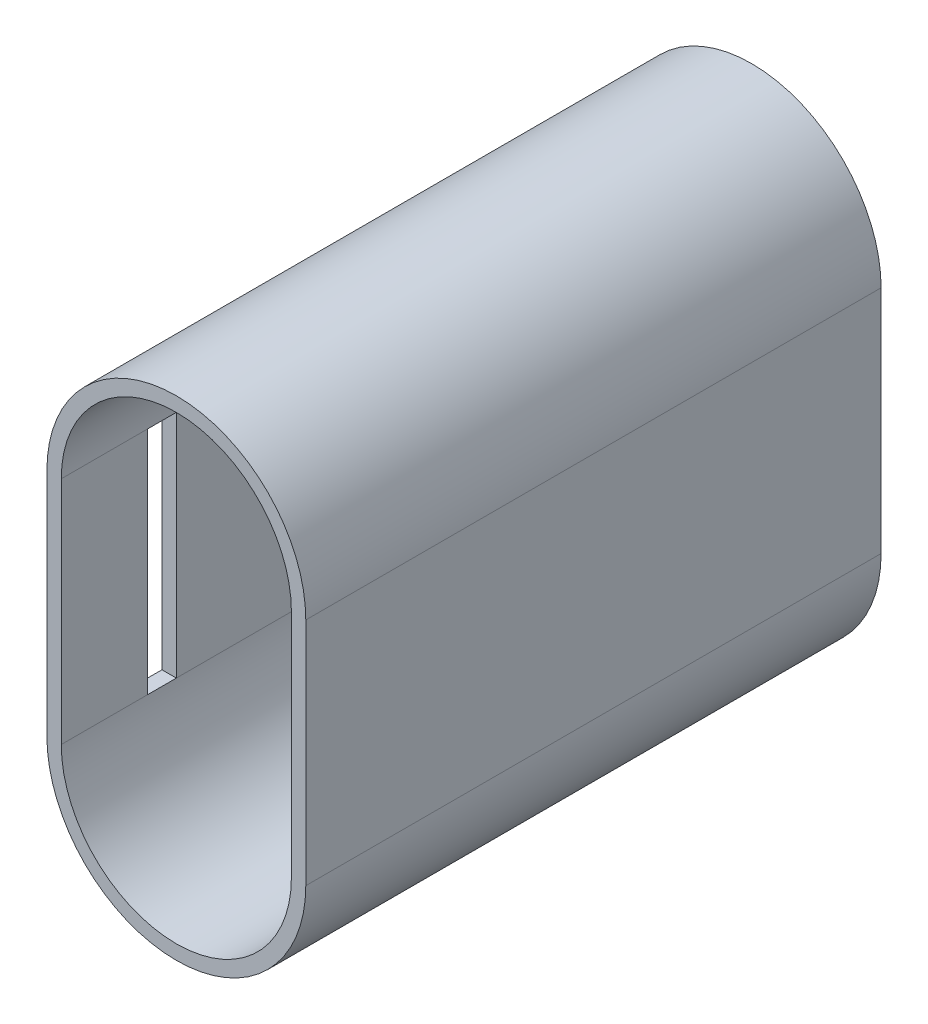
ISO-10303-21;
HEADER;
FILE_DESCRIPTION(('STEP AP214'),'2;1');
FILE_NAME('part.step','',(''),(''),'','','');
FILE_SCHEMA(('AUTOMOTIVE_DESIGN { 1 0 10303 214 1 1 1 1 }'));
ENDSEC;
DATA;
#1=APPLICATION_CONTEXT('core data for automotive mechanical design processes');
#2=APPLICATION_PROTOCOL_DEFINITION('international standard','automotive_design',2000,#1);
#3=PRODUCT_CONTEXT('',#1,'mechanical');
#4=PRODUCT('Part','Part','',(#3));
#5=PRODUCT_RELATED_PRODUCT_CATEGORY('part','',(#4));
#6=PRODUCT_DEFINITION_FORMATION('','',#4);
#7=PRODUCT_DEFINITION_CONTEXT('part definition',#1,'design');
#8=PRODUCT_DEFINITION('design','',#6,#7);
#9=PRODUCT_DEFINITION_SHAPE('','',#8);
#10=(LENGTH_UNIT() NAMED_UNIT(*) SI_UNIT(.MILLI.,.METRE.));
#11=(NAMED_UNIT(*) PLANE_ANGLE_UNIT() SI_UNIT($,.RADIAN.));
#12=(NAMED_UNIT(*) SI_UNIT($,.STERADIAN.) SOLID_ANGLE_UNIT());
#13=UNCERTAINTY_MEASURE_WITH_UNIT(LENGTH_MEASURE(1.E-05),#10,'distance_accuracy_value','');
#14=(GEOMETRIC_REPRESENTATION_CONTEXT(3) GLOBAL_UNCERTAINTY_ASSIGNED_CONTEXT((#13)) GLOBAL_UNIT_ASSIGNED_CONTEXT((#10,
#11,#12)) REPRESENTATION_CONTEXT('',''));
#15=CARTESIAN_POINT('',(0.,0.,0.));
#16=DIRECTION('',(0.,0.,1.));
#17=DIRECTION('',(1.,0.,0.));
#18=AXIS2_PLACEMENT_3D('',#15,#16,#17);
#19=CARTESIAN_POINT('',(-45.,-40.,200.));
#20=DIRECTION('',(1.,0.,0.));
#21=DIRECTION('',(0.,1.,0.));
#22=AXIS2_PLACEMENT_3D('',#19,#20,#21);
#23=PLANE('',#22);
#24=DIRECTION('',(0.,-1.,0.));
#25=VECTOR('',#24,1.);
#26=CARTESIAN_POINT('',(-45.,0.,170.));
#27=LINE('',#26,#25);
#28=CARTESIAN_POINT('',(-45.,40.,170.));
#29=VERTEX_POINT('',#28);
#30=CARTESIAN_POINT('',(-45.,-40.,170.));
#31=VERTEX_POINT('',#30);
#32=EDGE_CURVE('E56',#29,#31,#27,.T.);
#33=ORIENTED_EDGE('',*,*,#32,.T.);
#34=DIRECTION('',(0.,0.,-1.));
#35=VECTOR('',#34,1.);
#36=CARTESIAN_POINT('',(-45.,-40.,200.));
#37=LINE('',#36,#35);
#38=CARTESIAN_POINT('',(-45.,-40.,200.));
#39=VERTEX_POINT('',#38);
#40=EDGE_CURVE('E178',#39,#31,#37,.T.);
#41=ORIENTED_EDGE('',*,*,#40,.F.);
#42=DIRECTION('',(0.,-1.,0.));
#43=VECTOR('',#42,1.);
#44=CARTESIAN_POINT('',(-45.,-40.,200.));
#45=LINE('',#44,#43);
#46=CARTESIAN_POINT('',(-45.,40.,200.));
#47=VERTEX_POINT('',#46);
#48=EDGE_CURVE('E195',#47,#39,#45,.T.);
#49=ORIENTED_EDGE('',*,*,#48,.F.);
#50=DIRECTION('',(0.,0.,-1.));
#51=VECTOR('',#50,1.);
#52=CARTESIAN_POINT('',(-45.,40.,200.));
#53=LINE('',#52,#51);
#54=EDGE_CURVE('E181',#47,#29,#53,.T.);
#55=ORIENTED_EDGE('',*,*,#54,.T.);
#56=EDGE_LOOP('',(#33,#41,#49,#55));
#57=FACE_BOUND('',#56,.T.);
#58=ADVANCED_FACE('F41',(#57),#23,.F.);
#59=CARTESIAN_POINT('',(-40.,-40.,200.));
#60=DIRECTION('',(1.,0.,0.));
#61=DIRECTION('',(0.,1.,0.));
#62=AXIS2_PLACEMENT_3D('',#59,#60,#61);
#63=PLANE('',#62);
#64=DIRECTION('',(0.,0.,-1.));
#65=VECTOR('',#64,1.);
#66=CARTESIAN_POINT('',(-40.,-40.,200.));
#67=LINE('',#66,#65);
#68=CARTESIAN_POINT('',(-40.,-40.,200.));
#69=VERTEX_POINT('',#68);
#70=CARTESIAN_POINT('',(-40.,-40.,170.));
#71=VERTEX_POINT('',#70);
#72=EDGE_CURVE('E228',#69,#71,#67,.T.);
#73=ORIENTED_EDGE('',*,*,#72,.T.);
#74=DIRECTION('',(0.,-1.,0.));
#75=VECTOR('',#74,1.);
#76=CARTESIAN_POINT('',(-40.,0.,170.));
#77=LINE('',#76,#75);
#78=CARTESIAN_POINT('',(-40.,40.,170.));
#79=VERTEX_POINT('',#78);
#80=EDGE_CURVE('E157',#79,#71,#77,.T.);
#81=ORIENTED_EDGE('',*,*,#80,.F.);
#82=DIRECTION('',(0.,0.,-1.));
#83=VECTOR('',#82,1.);
#84=CARTESIAN_POINT('',(-40.,40.,200.));
#85=LINE('',#84,#83);
#86=CARTESIAN_POINT('',(-40.,40.,200.));
#87=VERTEX_POINT('',#86);
#88=EDGE_CURVE('E223',#87,#79,#85,.T.);
#89=ORIENTED_EDGE('',*,*,#88,.F.);
#90=DIRECTION('',(0.,-1.,0.));
#91=VECTOR('',#90,1.);
#92=CARTESIAN_POINT('',(-40.,-40.,200.));
#93=LINE('',#92,#91);
#94=EDGE_CURVE('E247',#87,#69,#93,.T.);
#95=ORIENTED_EDGE('',*,*,#94,.T.);
#96=EDGE_LOOP('',(#73,#81,#89,#95));
#97=FACE_BOUND('',#96,.T.);
#98=ADVANCED_FACE('F359',(#97),#63,.T.);
#99=CARTESIAN_POINT('',(-45.,-40.,160.));
#100=VERTEX_POINT('',#99);
#101=CARTESIAN_POINT('',(-45.,-40.,43.));
#102=VERTEX_POINT('',#101);
#103=EDGE_CURVE('E189',#100,#102,#37,.T.);
#104=ORIENTED_EDGE('',*,*,#103,.F.);
#105=DIRECTION('',(0.,-1.,0.));
#106=VECTOR('',#105,1.);
#107=CARTESIAN_POINT('',(-45.,0.,160.));
#108=LINE('',#107,#106);
#109=CARTESIAN_POINT('',(-45.,40.,160.));
#110=VERTEX_POINT('',#109);
#111=EDGE_CURVE('E172',#110,#100,#108,.T.);
#112=ORIENTED_EDGE('',*,*,#111,.F.);
#113=CARTESIAN_POINT('',(-45.,40.,43.));
#114=VERTEX_POINT('',#113);
#115=EDGE_CURVE('E192',#110,#114,#53,.T.);
#116=ORIENTED_EDGE('',*,*,#115,.T.);
#117=DIRECTION('',(0.,1.,0.));
#118=VECTOR('',#117,1.);
#119=CARTESIAN_POINT('',(-45.,-40.,43.));
#120=LINE('',#119,#118);
#121=EDGE_CURVE('E259',#102,#114,#120,.T.);
#122=ORIENTED_EDGE('',*,*,#121,.F.);
#123=EDGE_LOOP('',(#104,#112,#116,#122));
#124=FACE_BOUND('',#123,.T.);
#125=ADVANCED_FACE('F307',(#124),#23,.F.);
#126=DIRECTION('',(0.,-1.,0.));
#127=VECTOR('',#126,1.);
#128=CARTESIAN_POINT('',(-40.,0.,160.));
#129=LINE('',#128,#127);
#130=CARTESIAN_POINT('',(-40.,40.,160.));
#131=VERTEX_POINT('',#130);
#132=CARTESIAN_POINT('',(-40.,-40.,160.));
#133=VERTEX_POINT('',#132);
#134=EDGE_CURVE('E290',#131,#133,#129,.T.);
#135=ORIENTED_EDGE('',*,*,#134,.T.);
#136=CARTESIAN_POINT('',(-40.,-40.,43.));
#137=VERTEX_POINT('',#136);
#138=EDGE_CURVE('E231',#133,#137,#67,.T.);
#139=ORIENTED_EDGE('',*,*,#138,.T.);
#140=DIRECTION('',(0.,-1.,0.));
#141=VECTOR('',#140,1.);
#142=CARTESIAN_POINT('',(-40.,0.,43.));
#143=LINE('',#142,#141);
#144=CARTESIAN_POINT('',(-40.,40.,43.));
#145=VERTEX_POINT('',#144);
#146=EDGE_CURVE('E182',#145,#137,#143,.T.);
#147=ORIENTED_EDGE('',*,*,#146,.F.);
#148=EDGE_CURVE('E226',#131,#145,#85,.T.);
#149=ORIENTED_EDGE('',*,*,#148,.F.);
#150=EDGE_LOOP('',(#135,#139,#147,#149));
#151=FACE_BOUND('',#150,.T.);
#152=ADVANCED_FACE('F319',(#151),#63,.T.);
#153=CARTESIAN_POINT('',(0.,-40.,200.));
#154=DIRECTION('',(0.,0.,1.));
#155=DIRECTION('',(1.,0.,0.));
#156=AXIS2_PLACEMENT_3D('',#153,#154,#155);
#157=PLANE('',#156);
#158=CARTESIAN_POINT('',(0.,-40.,200.));
#159=DIRECTION('',(0.,0.,1.));
#160=DIRECTION('',(1.,0.,0.));
#161=AXIS2_PLACEMENT_3D('',#158,#159,#160);
#162=CIRCLE('',#161,45.);
#163=CARTESIAN_POINT('',(45.,-40.,200.));
#164=VERTEX_POINT('',#163);
#165=EDGE_CURVE('E187',#39,#164,#162,.T.);
#166=ORIENTED_EDGE('',*,*,#165,.T.);
#167=DIRECTION('',(0.,1.,0.));
#168=VECTOR('',#167,1.);
#169=CARTESIAN_POINT('',(45.,-40.,200.));
#170=LINE('',#169,#168);
#171=CARTESIAN_POINT('',(45.,40.,200.));
#172=VERTEX_POINT('',#171);
#173=EDGE_CURVE('E202',#164,#172,#170,.T.);
#174=ORIENTED_EDGE('',*,*,#173,.T.);
#175=CARTESIAN_POINT('',(0.,40.,200.));
#176=DIRECTION('',(0.,0.,1.));
#177=DIRECTION('',(1.,0.,0.));
#178=AXIS2_PLACEMENT_3D('',#175,#176,#177);
#179=CIRCLE('',#178,45.);
#180=EDGE_CURVE('E199',#172,#47,#179,.T.);
#181=ORIENTED_EDGE('',*,*,#180,.T.);
#182=ORIENTED_EDGE('',*,*,#48,.T.);
#183=EDGE_LOOP('',(#166,#174,#181,#182));
#184=FACE_BOUND('',#183,.T.);
#185=DIRECTION('',(0.,1.,0.));
#186=VECTOR('',#185,1.);
#187=CARTESIAN_POINT('',(40.,-40.,200.));
#188=LINE('',#187,#186);
#189=CARTESIAN_POINT('',(40.,-40.,200.));
#190=VERTEX_POINT('',#189);
#191=CARTESIAN_POINT('',(40.,40.,200.));
#192=VERTEX_POINT('',#191);
#193=EDGE_CURVE('E252',#190,#192,#188,.T.);
#194=ORIENTED_EDGE('',*,*,#193,.F.);
#195=CARTESIAN_POINT('',(0.,-40.,200.));
#196=DIRECTION('',(0.,0.,1.));
#197=DIRECTION('',(1.,0.,0.));
#198=AXIS2_PLACEMENT_3D('',#195,#196,#197);
#199=CIRCLE('',#198,40.);
#200=EDGE_CURVE('E236',#69,#190,#199,.T.);
#201=ORIENTED_EDGE('',*,*,#200,.F.);
#202=ORIENTED_EDGE('',*,*,#94,.F.);
#203=CARTESIAN_POINT('',(0.,40.,200.));
#204=DIRECTION('',(0.,0.,1.));
#205=DIRECTION('',(1.,0.,0.));
#206=AXIS2_PLACEMENT_3D('',#203,#204,#205);
#207=CIRCLE('',#206,40.);
#208=EDGE_CURVE('E249',#192,#87,#207,.T.);
#209=ORIENTED_EDGE('',*,*,#208,.F.);
#210=EDGE_LOOP('',(#194,#201,#202,#209));
#211=FACE_BOUND('',#210,.T.);
#212=ADVANCED_FACE('F354',(#184,#211),#157,.T.);
#213=CARTESIAN_POINT('',(0.,-40.,0.));
#214=DIRECTION('',(0.,0.,1.));
#215=DIRECTION('',(1.,0.,0.));
#216=AXIS2_PLACEMENT_3D('',#213,#214,#215);
#217=PLANE('',#216);
#218=CARTESIAN_POINT('',(0.,-40.,0.));
#219=DIRECTION('',(0.,0.,1.));
#220=DIRECTION('',(1.,0.,0.));
#221=AXIS2_PLACEMENT_3D('',#218,#219,#220);
#222=CIRCLE('',#221,45.);
#223=CARTESIAN_POINT('',(-45.,-40.,0.));
#224=VERTEX_POINT('',#223);
#225=CARTESIAN_POINT('',(45.,-40.,0.));
#226=VERTEX_POINT('',#225);
#227=EDGE_CURVE('E206',#224,#226,#222,.T.);
#228=ORIENTED_EDGE('',*,*,#227,.F.);
#229=DIRECTION('',(0.,-1.,0.));
#230=VECTOR('',#229,1.);
#231=CARTESIAN_POINT('',(-45.,-40.,0.));
#232=LINE('',#231,#230);
#233=CARTESIAN_POINT('',(-45.,40.,0.));
#234=VERTEX_POINT('',#233);
#235=EDGE_CURVE('E213',#234,#224,#232,.T.);
#236=ORIENTED_EDGE('',*,*,#235,.F.);
#237=CARTESIAN_POINT('',(0.,40.,0.));
#238=DIRECTION('',(0.,0.,1.));
#239=DIRECTION('',(1.,0.,0.));
#240=AXIS2_PLACEMENT_3D('',#237,#238,#239);
#241=CIRCLE('',#240,45.);
#242=CARTESIAN_POINT('',(45.,40.,0.));
#243=VERTEX_POINT('',#242);
#244=EDGE_CURVE('E211',#243,#234,#241,.T.);
#245=ORIENTED_EDGE('',*,*,#244,.F.);
#246=DIRECTION('',(0.,1.,0.));
#247=VECTOR('',#246,1.);
#248=CARTESIAN_POINT('',(45.,-40.,0.));
#249=LINE('',#248,#247);
#250=EDGE_CURVE('E208',#226,#243,#249,.T.);
#251=ORIENTED_EDGE('',*,*,#250,.F.);
#252=EDGE_LOOP('',(#228,#236,#245,#251));
#253=FACE_BOUND('',#252,.T.);
#254=CARTESIAN_POINT('',(0.,-40.,0.));
#255=DIRECTION('',(0.,0.,1.));
#256=DIRECTION('',(1.,0.,0.));
#257=AXIS2_PLACEMENT_3D('',#254,#255,#256);
#258=CIRCLE('',#257,40.);
#259=CARTESIAN_POINT('',(-40.,-40.,0.));
#260=VERTEX_POINT('',#259);
#261=CARTESIAN_POINT('',(40.,-40.,0.));
#262=VERTEX_POINT('',#261);
#263=EDGE_CURVE('E243',#260,#262,#258,.T.);
#264=ORIENTED_EDGE('',*,*,#263,.T.);
#265=DIRECTION('',(0.,1.,0.));
#266=VECTOR('',#265,1.);
#267=CARTESIAN_POINT('',(40.,-40.,0.));
#268=LINE('',#267,#266);
#269=CARTESIAN_POINT('',(40.,40.,0.));
#270=VERTEX_POINT('',#269);
#271=EDGE_CURVE('E240',#262,#270,#268,.T.);
#272=ORIENTED_EDGE('',*,*,#271,.T.);
#273=CARTESIAN_POINT('',(0.,40.,0.));
#274=DIRECTION('',(0.,0.,1.));
#275=DIRECTION('',(1.,0.,0.));
#276=AXIS2_PLACEMENT_3D('',#273,#274,#275);
#277=CIRCLE('',#276,40.);
#278=CARTESIAN_POINT('',(-40.,40.,0.));
#279=VERTEX_POINT('',#278);
#280=EDGE_CURVE('E237',#270,#279,#277,.T.);
#281=ORIENTED_EDGE('',*,*,#280,.T.);
#282=DIRECTION('',(0.,-1.,0.));
#283=VECTOR('',#282,1.);
#284=CARTESIAN_POINT('',(-40.,-40.,0.));
#285=LINE('',#284,#283);
#286=EDGE_CURVE('E233',#279,#260,#285,.T.);
#287=ORIENTED_EDGE('',*,*,#286,.T.);
#288=EDGE_LOOP('',(#264,#272,#281,#287));
#289=FACE_BOUND('',#288,.T.);
#290=ADVANCED_FACE('F332',(#253,#289),#217,.F.);
#291=CARTESIAN_POINT('',(0.,-40.,200.));
#292=DIRECTION('',(0.,0.,-1.));
#293=DIRECTION('',(-1.,0.,0.));
#294=AXIS2_PLACEMENT_3D('',#291,#292,#293);
#295=CYLINDRICAL_SURFACE('',#294,45.);
#296=ORIENTED_EDGE('',*,*,#227,.T.);
#297=DIRECTION('',(0.,0.,-1.));
#298=VECTOR('',#297,1.);
#299=CARTESIAN_POINT('',(45.,-40.,200.));
#300=LINE('',#299,#298);
#301=EDGE_CURVE('E11',#164,#226,#300,.T.);
#302=ORIENTED_EDGE('',*,*,#301,.F.);
#303=ORIENTED_EDGE('',*,*,#165,.F.);
#304=ORIENTED_EDGE('',*,*,#40,.T.);
#305=DIRECTION('',(0.,0.,1.));
#306=VECTOR('',#305,1.);
#307=CARTESIAN_POINT('',(-45.,-40.,0.));
#308=LINE('',#307,#306);
#309=EDGE_CURVE('E164',#100,#31,#308,.T.);
#310=ORIENTED_EDGE('',*,*,#309,.F.);
#311=ORIENTED_EDGE('',*,*,#103,.T.);
#312=DIRECTION('',(0.,0.,-1.));
#313=VECTOR('',#312,1.);
#314=CARTESIAN_POINT('',(-45.,-40.,200.));
#315=LINE('',#314,#313);
#316=CARTESIAN_POINT('',(-45.,-40.,30.));
#317=VERTEX_POINT('',#316);
#318=EDGE_CURVE('E257',#102,#317,#315,.T.);
#319=ORIENTED_EDGE('',*,*,#318,.T.);
#320=EDGE_CURVE('E191',#317,#224,#37,.T.);
#321=ORIENTED_EDGE('',*,*,#320,.T.);
#322=EDGE_LOOP('',(#296,#302,#303,#304,#310,#311,#319,#321));
#323=FACE_BOUND('',#322,.T.);
#324=ADVANCED_FACE('F43',(#323),#295,.T.);
#325=CARTESIAN_POINT('',(45.,-40.,200.));
#326=DIRECTION('',(-1.,0.,0.));
#327=DIRECTION('',(0.,-1.,0.));
#328=AXIS2_PLACEMENT_3D('',#325,#326,#327);
#329=PLANE('',#328);
#330=ORIENTED_EDGE('',*,*,#250,.T.);
#331=DIRECTION('',(0.,0.,-1.));
#332=VECTOR('',#331,1.);
#333=CARTESIAN_POINT('',(45.,40.,200.));
#334=LINE('',#333,#332);
#335=EDGE_CURVE('E49',#172,#243,#334,.T.);
#336=ORIENTED_EDGE('',*,*,#335,.F.);
#337=ORIENTED_EDGE('',*,*,#173,.F.);
#338=ORIENTED_EDGE('',*,*,#301,.T.);
#339=EDGE_LOOP('',(#330,#336,#337,#338));
#340=FACE_BOUND('',#339,.T.);
#341=ADVANCED_FACE('F353',(#340),#329,.F.);
#342=CARTESIAN_POINT('',(0.,40.,200.));
#343=DIRECTION('',(0.,0.,-1.));
#344=DIRECTION('',(-1.,0.,0.));
#345=AXIS2_PLACEMENT_3D('',#342,#343,#344);
#346=CYLINDRICAL_SURFACE('',#345,45.);
#347=ORIENTED_EDGE('',*,*,#244,.T.);
#348=CARTESIAN_POINT('',(-45.,40.,30.));
#349=VERTEX_POINT('',#348);
#350=EDGE_CURVE('E188',#349,#234,#53,.T.);
#351=ORIENTED_EDGE('',*,*,#350,.F.);
#352=DIRECTION('',(0.,0.,1.));
#353=VECTOR('',#352,1.);
#354=CARTESIAN_POINT('',(-45.,40.,200.));
#355=LINE('',#354,#353);
#356=EDGE_CURVE('E262',#349,#114,#355,.T.);
#357=ORIENTED_EDGE('',*,*,#356,.T.);
#358=ORIENTED_EDGE('',*,*,#115,.F.);
#359=DIRECTION('',(0.,0.,-1.));
#360=VECTOR('',#359,1.);
#361=CARTESIAN_POINT('',(-45.,40.,0.));
#362=LINE('',#361,#360);
#363=EDGE_CURVE('E296',#29,#110,#362,.T.);
#364=ORIENTED_EDGE('',*,*,#363,.F.);
#365=ORIENTED_EDGE('',*,*,#54,.F.);
#366=ORIENTED_EDGE('',*,*,#180,.F.);
#367=ORIENTED_EDGE('',*,*,#335,.T.);
#368=EDGE_LOOP('',(#347,#351,#357,#358,#364,#365,#366,#367));
#369=FACE_BOUND('',#368,.T.);
#370=ADVANCED_FACE('F346',(#369),#346,.T.);
#371=ORIENTED_EDGE('',*,*,#320,.F.);
#372=DIRECTION('',(0.,1.,0.));
#373=VECTOR('',#372,1.);
#374=CARTESIAN_POINT('',(-45.,-40.,30.));
#375=LINE('',#374,#373);
#376=EDGE_CURVE('E246',#317,#349,#375,.T.);
#377=ORIENTED_EDGE('',*,*,#376,.T.);
#378=ORIENTED_EDGE('',*,*,#350,.T.);
#379=ORIENTED_EDGE('',*,*,#235,.T.);
#380=EDGE_LOOP('',(#371,#377,#378,#379));
#381=FACE_BOUND('',#380,.T.);
#382=ADVANCED_FACE('F344',(#381),#23,.F.);
#383=CARTESIAN_POINT('',(0.,-40.,200.));
#384=DIRECTION('',(0.,0.,-1.));
#385=DIRECTION('',(-1.,0.,0.));
#386=AXIS2_PLACEMENT_3D('',#383,#384,#385);
#387=CYLINDRICAL_SURFACE('',#386,40.);
#388=ORIENTED_EDGE('',*,*,#263,.F.);
#389=CARTESIAN_POINT('',(-40.,-40.,30.));
#390=VERTEX_POINT('',#389);
#391=EDGE_CURVE('E232',#390,#260,#67,.T.);
#392=ORIENTED_EDGE('',*,*,#391,.F.);
#393=DIRECTION('',(0.,0.,1.));
#394=VECTOR('',#393,1.);
#395=CARTESIAN_POINT('',(-40.,-40.,0.));
#396=LINE('',#395,#394);
#397=EDGE_CURVE('E272',#390,#137,#396,.T.);
#398=ORIENTED_EDGE('',*,*,#397,.T.);
#399=ORIENTED_EDGE('',*,*,#138,.F.);
#400=DIRECTION('',(0.,0.,1.));
#401=VECTOR('',#400,1.);
#402=CARTESIAN_POINT('',(-40.,-40.,0.));
#403=LINE('',#402,#401);
#404=EDGE_CURVE('E161',#133,#71,#403,.T.);
#405=ORIENTED_EDGE('',*,*,#404,.T.);
#406=ORIENTED_EDGE('',*,*,#72,.F.);
#407=ORIENTED_EDGE('',*,*,#200,.T.);
#408=DIRECTION('',(0.,0.,-1.));
#409=VECTOR('',#408,1.);
#410=CARTESIAN_POINT('',(40.,-40.,200.));
#411=LINE('',#410,#409);
#412=EDGE_CURVE('E209',#190,#262,#411,.T.);
#413=ORIENTED_EDGE('',*,*,#412,.T.);
#414=EDGE_LOOP('',(#388,#392,#398,#399,#405,#406,#407,#413));
#415=FACE_BOUND('',#414,.T.);
#416=ADVANCED_FACE('F329',(#415),#387,.F.);
#417=CARTESIAN_POINT('',(40.,-40.,200.));
#418=DIRECTION('',(-1.,0.,0.));
#419=DIRECTION('',(0.,-1.,0.));
#420=AXIS2_PLACEMENT_3D('',#417,#418,#419);
#421=PLANE('',#420);
#422=ORIENTED_EDGE('',*,*,#271,.F.);
#423=ORIENTED_EDGE('',*,*,#412,.F.);
#424=ORIENTED_EDGE('',*,*,#193,.T.);
#425=DIRECTION('',(0.,0.,-1.));
#426=VECTOR('',#425,1.);
#427=CARTESIAN_POINT('',(40.,40.,200.));
#428=LINE('',#427,#426);
#429=EDGE_CURVE('E221',#192,#270,#428,.T.);
#430=ORIENTED_EDGE('',*,*,#429,.T.);
#431=EDGE_LOOP('',(#422,#423,#424,#430));
#432=FACE_BOUND('',#431,.T.);
#433=ADVANCED_FACE('F365',(#432),#421,.T.);
#434=CARTESIAN_POINT('',(0.,40.,200.));
#435=DIRECTION('',(0.,0.,-1.));
#436=DIRECTION('',(-1.,0.,0.));
#437=AXIS2_PLACEMENT_3D('',#434,#435,#436);
#438=CYLINDRICAL_SURFACE('',#437,40.);
#439=ORIENTED_EDGE('',*,*,#280,.F.);
#440=ORIENTED_EDGE('',*,*,#429,.F.);
#441=ORIENTED_EDGE('',*,*,#208,.T.);
#442=ORIENTED_EDGE('',*,*,#88,.T.);
#443=DIRECTION('',(0.,0.,-1.));
#444=VECTOR('',#443,1.);
#445=CARTESIAN_POINT('',(-40.,40.,0.));
#446=LINE('',#445,#444);
#447=EDGE_CURVE('E171',#79,#131,#446,.T.);
#448=ORIENTED_EDGE('',*,*,#447,.T.);
#449=ORIENTED_EDGE('',*,*,#148,.T.);
#450=DIRECTION('',(0.,0.,-1.));
#451=VECTOR('',#450,1.);
#452=CARTESIAN_POINT('',(-40.,40.,0.));
#453=LINE('',#452,#451);
#454=CARTESIAN_POINT('',(-40.,40.,30.));
#455=VERTEX_POINT('',#454);
#456=EDGE_CURVE('E268',#145,#455,#453,.T.);
#457=ORIENTED_EDGE('',*,*,#456,.T.);
#458=EDGE_CURVE('E227',#455,#279,#85,.T.);
#459=ORIENTED_EDGE('',*,*,#458,.T.);
#460=EDGE_LOOP('',(#439,#440,#441,#442,#448,#449,#457,#459));
#461=FACE_BOUND('',#460,.T.);
#462=ADVANCED_FACE('F336',(#461),#438,.F.);
#463=DIRECTION('',(0.,-1.,0.));
#464=VECTOR('',#463,1.);
#465=CARTESIAN_POINT('',(-40.,0.,30.));
#466=LINE('',#465,#464);
#467=EDGE_CURVE('E273',#455,#390,#466,.T.);
#468=ORIENTED_EDGE('',*,*,#467,.T.);
#469=ORIENTED_EDGE('',*,*,#391,.T.);
#470=ORIENTED_EDGE('',*,*,#286,.F.);
#471=ORIENTED_EDGE('',*,*,#458,.F.);
#472=EDGE_LOOP('',(#468,#469,#470,#471));
#473=FACE_BOUND('',#472,.T.);
#474=ADVANCED_FACE('F326',(#473),#63,.T.);
#475=CARTESIAN_POINT('',(41.0493676718085,0.,30.));
#476=DIRECTION('',(0.,0.,-1.));
#477=DIRECTION('',(0.,1.,0.));
#478=AXIS2_PLACEMENT_3D('',#475,#476,#477);
#479=PLANE('',#478);
#480=DIRECTION('',(-1.,0.,0.));
#481=VECTOR('',#480,1.);
#482=CARTESIAN_POINT('',(41.0493676718085,-40.,30.));
#483=LINE('',#482,#481);
#484=EDGE_CURVE('E269',#390,#317,#483,.T.);
#485=ORIENTED_EDGE('',*,*,#484,.F.);
#486=ORIENTED_EDGE('',*,*,#467,.F.);
#487=DIRECTION('',(-1.,0.,0.));
#488=VECTOR('',#487,1.);
#489=CARTESIAN_POINT('',(41.0493676718085,40.,30.));
#490=LINE('',#489,#488);
#491=EDGE_CURVE('E265',#455,#349,#490,.T.);
#492=ORIENTED_EDGE('',*,*,#491,.T.);
#493=ORIENTED_EDGE('',*,*,#376,.F.);
#494=EDGE_LOOP('',(#485,#486,#492,#493));
#495=FACE_BOUND('',#494,.T.);
#496=ADVANCED_FACE('F342',(#495),#479,.F.);
#497=CARTESIAN_POINT('',(41.0493676718085,-40.,0.));
#498=DIRECTION('',(0.,-1.,0.));
#499=DIRECTION('',(0.,0.,-1.));
#500=AXIS2_PLACEMENT_3D('',#497,#498,#499);
#501=PLANE('',#500);
#502=DIRECTION('',(-1.,0.,0.));
#503=VECTOR('',#502,1.);
#504=CARTESIAN_POINT('',(41.0493676718085,-40.,43.));
#505=LINE('',#504,#503);
#506=EDGE_CURVE('E274',#137,#102,#505,.T.);
#507=ORIENTED_EDGE('',*,*,#506,.F.);
#508=ORIENTED_EDGE('',*,*,#397,.F.);
#509=ORIENTED_EDGE('',*,*,#484,.T.);
#510=ORIENTED_EDGE('',*,*,#318,.F.);
#511=EDGE_LOOP('',(#507,#508,#509,#510));
#512=FACE_BOUND('',#511,.T.);
#513=ADVANCED_FACE('F311',(#512),#501,.F.);
#514=CARTESIAN_POINT('',(41.0493676718085,0.,43.));
#515=DIRECTION('',(0.,0.,-1.));
#516=DIRECTION('',(0.,1.,0.));
#517=AXIS2_PLACEMENT_3D('',#514,#515,#516);
#518=PLANE('',#517);
#519=ORIENTED_EDGE('',*,*,#121,.T.);
#520=DIRECTION('',(-1.,0.,0.));
#521=VECTOR('',#520,1.);
#522=CARTESIAN_POINT('',(41.0493676718085,40.,43.));
#523=LINE('',#522,#521);
#524=EDGE_CURVE('E277',#145,#114,#523,.T.);
#525=ORIENTED_EDGE('',*,*,#524,.F.);
#526=ORIENTED_EDGE('',*,*,#146,.T.);
#527=ORIENTED_EDGE('',*,*,#506,.T.);
#528=EDGE_LOOP('',(#519,#525,#526,#527));
#529=FACE_BOUND('',#528,.T.);
#530=ADVANCED_FACE('F314',(#529),#518,.T.);
#531=CARTESIAN_POINT('',(41.0493676718085,40.,0.));
#532=DIRECTION('',(0.,1.,0.));
#533=DIRECTION('',(0.,0.,1.));
#534=AXIS2_PLACEMENT_3D('',#531,#532,#533);
#535=PLANE('',#534);
#536=ORIENTED_EDGE('',*,*,#491,.F.);
#537=ORIENTED_EDGE('',*,*,#456,.F.);
#538=ORIENTED_EDGE('',*,*,#524,.T.);
#539=ORIENTED_EDGE('',*,*,#356,.F.);
#540=EDGE_LOOP('',(#536,#537,#538,#539));
#541=FACE_BOUND('',#540,.T.);
#542=ADVANCED_FACE('F340',(#541),#535,.F.);
#543=CARTESIAN_POINT('',(40.6225774829855,40.,0.));
#544=DIRECTION('',(0.,1.,0.));
#545=DIRECTION('',(-1.,0.,0.));
#546=AXIS2_PLACEMENT_3D('',#543,#544,#545);
#547=PLANE('',#546);
#548=DIRECTION('',(-1.,0.,0.));
#549=VECTOR('',#548,1.);
#550=CARTESIAN_POINT('',(40.6225774829855,40.,170.));
#551=LINE('',#550,#549);
#552=EDGE_CURVE('E160',#79,#29,#551,.T.);
#553=ORIENTED_EDGE('',*,*,#552,.T.);
#554=ORIENTED_EDGE('',*,*,#363,.T.);
#555=DIRECTION('',(-1.,0.,0.));
#556=VECTOR('',#555,1.);
#557=CARTESIAN_POINT('',(40.6225774829855,40.,160.));
#558=LINE('',#557,#556);
#559=EDGE_CURVE('E64',#131,#110,#558,.T.);
#560=ORIENTED_EDGE('',*,*,#559,.F.);
#561=ORIENTED_EDGE('',*,*,#447,.F.);
#562=EDGE_LOOP('',(#553,#554,#560,#561));
#563=FACE_BOUND('',#562,.T.);
#564=ADVANCED_FACE('F357',(#563),#547,.F.);
#565=CARTESIAN_POINT('',(40.6225774829855,0.,160.));
#566=DIRECTION('',(0.,0.,-1.));
#567=DIRECTION('',(-1.,0.,0.));
#568=AXIS2_PLACEMENT_3D('',#565,#566,#567);
#569=PLANE('',#568);
#570=ORIENTED_EDGE('',*,*,#559,.T.);
#571=ORIENTED_EDGE('',*,*,#111,.T.);
#572=DIRECTION('',(-1.,0.,0.));
#573=VECTOR('',#572,1.);
#574=CARTESIAN_POINT('',(40.6225774829855,-40.,160.));
#575=LINE('',#574,#573);
#576=EDGE_CURVE('E167',#133,#100,#575,.T.);
#577=ORIENTED_EDGE('',*,*,#576,.F.);
#578=ORIENTED_EDGE('',*,*,#134,.F.);
#579=EDGE_LOOP('',(#570,#571,#577,#578));
#580=FACE_BOUND('',#579,.T.);
#581=ADVANCED_FACE('F303',(#580),#569,.F.);
#582=CARTESIAN_POINT('',(40.6225774829855,-40.,0.));
#583=DIRECTION('',(0.,-1.,0.));
#584=DIRECTION('',(1.,0.,0.));
#585=AXIS2_PLACEMENT_3D('',#582,#583,#584);
#586=PLANE('',#585);
#587=ORIENTED_EDGE('',*,*,#576,.T.);
#588=ORIENTED_EDGE('',*,*,#309,.T.);
#589=DIRECTION('',(-1.,0.,0.));
#590=VECTOR('',#589,1.);
#591=CARTESIAN_POINT('',(40.6225774829855,-40.,170.));
#592=LINE('',#591,#590);
#593=EDGE_CURVE('E153',#71,#31,#592,.T.);
#594=ORIENTED_EDGE('',*,*,#593,.F.);
#595=ORIENTED_EDGE('',*,*,#404,.F.);
#596=EDGE_LOOP('',(#587,#588,#594,#595));
#597=FACE_BOUND('',#596,.T.);
#598=ADVANCED_FACE('F165',(#597),#586,.F.);
#599=CARTESIAN_POINT('',(40.6225774829855,0.,170.));
#600=DIRECTION('',(0.,0.,-1.));
#601=DIRECTION('',(-1.,0.,0.));
#602=AXIS2_PLACEMENT_3D('',#599,#600,#601);
#603=PLANE('',#602);
#604=ORIENTED_EDGE('',*,*,#80,.T.);
#605=ORIENTED_EDGE('',*,*,#593,.T.);
#606=ORIENTED_EDGE('',*,*,#32,.F.);
#607=ORIENTED_EDGE('',*,*,#552,.F.);
#608=EDGE_LOOP('',(#604,#605,#606,#607));
#609=FACE_BOUND('',#608,.T.);
#610=ADVANCED_FACE('F155',(#609),#603,.T.);
#611=CLOSED_SHELL('',(#58,#98,#125,#152,#212,#290,#324,#341,#370,#382,#416,#433,#462,#474,#496,
#513,#530,#542,#564,#581,#598,#610));
#612=MANIFOLD_SOLID_BREP('B2',#611);
#613=ADVANCED_BREP_SHAPE_REPRESENTATION('',(#18,#612),#14);
#614=SHAPE_DEFINITION_REPRESENTATION(#9,#613);
ENDSEC;
END-ISO-10303-21;
